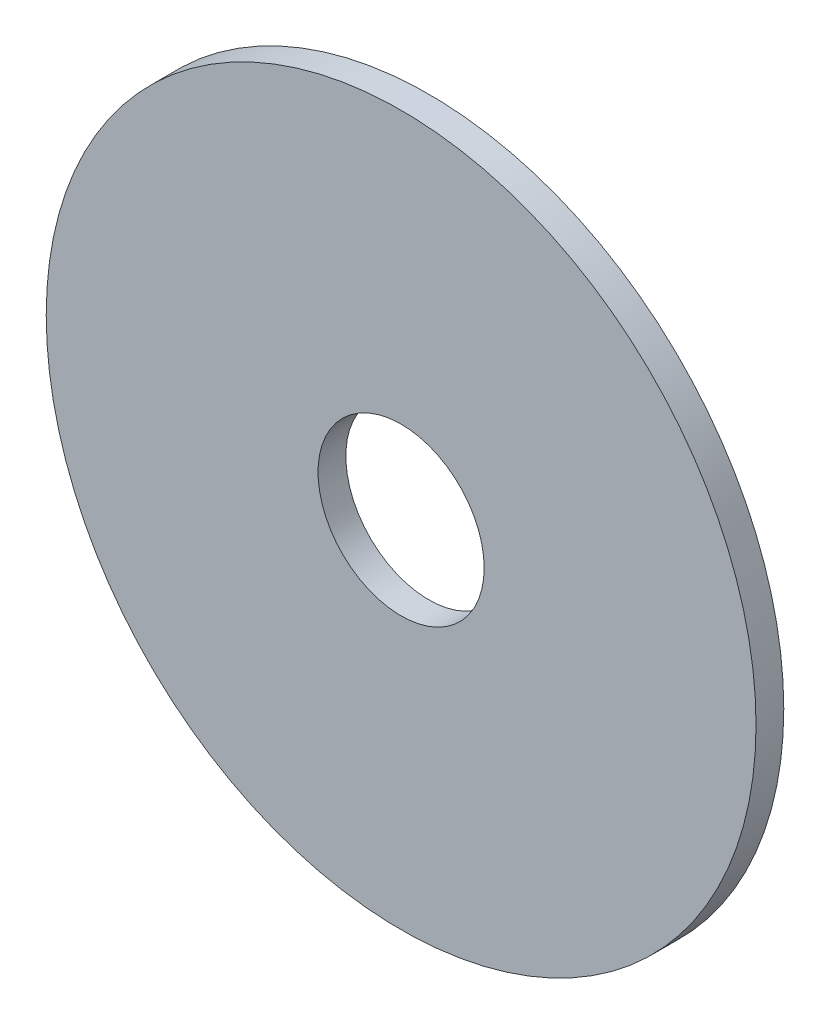
ISO-10303-21;
HEADER;
FILE_DESCRIPTION(('STEP AP214'),'2;1');
FILE_NAME('part.step','',(''),(''),'','','');
FILE_SCHEMA(('AUTOMOTIVE_DESIGN { 1 0 10303 214 1 1 1 1 }'));
ENDSEC;
DATA;
#1=APPLICATION_CONTEXT('core data for automotive mechanical design processes');
#2=APPLICATION_PROTOCOL_DEFINITION('international standard','automotive_design',2000,#1);
#3=PRODUCT_CONTEXT('',#1,'mechanical');
#4=PRODUCT('Part','Part','',(#3));
#5=PRODUCT_RELATED_PRODUCT_CATEGORY('part','',(#4));
#6=PRODUCT_DEFINITION_FORMATION('','',#4);
#7=PRODUCT_DEFINITION_CONTEXT('part definition',#1,'design');
#8=PRODUCT_DEFINITION('design','',#6,#7);
#9=PRODUCT_DEFINITION_SHAPE('','',#8);
#10=(LENGTH_UNIT() NAMED_UNIT(*) SI_UNIT(.MILLI.,.METRE.));
#11=(NAMED_UNIT(*) PLANE_ANGLE_UNIT() SI_UNIT($,.RADIAN.));
#12=(NAMED_UNIT(*) SI_UNIT($,.STERADIAN.) SOLID_ANGLE_UNIT());
#13=UNCERTAINTY_MEASURE_WITH_UNIT(LENGTH_MEASURE(1.E-05),#10,'distance_accuracy_value','');
#14=(GEOMETRIC_REPRESENTATION_CONTEXT(3) GLOBAL_UNCERTAINTY_ASSIGNED_CONTEXT((#13)) GLOBAL_UNIT_ASSIGNED_CONTEXT((#10,
#11,#12)) REPRESENTATION_CONTEXT('',''));
#15=CARTESIAN_POINT('',(0.,0.,0.));
#16=DIRECTION('',(0.,0.,1.));
#17=DIRECTION('',(1.,0.,0.));
#18=AXIS2_PLACEMENT_3D('',#15,#16,#17);
#19=CARTESIAN_POINT('',(0.,0.,6.));
#20=DIRECTION('',(0.,0.,-1.));
#21=DIRECTION('',(-1.,0.,0.));
#22=AXIS2_PLACEMENT_3D('',#19,#20,#21);
#23=CYLINDRICAL_SURFACE('',#22,76.73);
#24=CARTESIAN_POINT('',(0.,0.,6.));
#25=DIRECTION('',(0.,0.,1.));
#26=DIRECTION('',(1.,0.,0.));
#27=AXIS2_PLACEMENT_3D('',#24,#25,#26);
#28=CIRCLE('',#27,76.73);
#29=CARTESIAN_POINT('',(76.73,0.,6.));
#30=VERTEX_POINT('',#29);
#31=EDGE_CURVE('E10',#30,#30,#28,.T.);
#32=ORIENTED_EDGE('',*,*,#31,.F.);
#33=EDGE_LOOP('',(#32));
#34=FACE_BOUND('',#33,.T.);
#35=CARTESIAN_POINT('',(0.,0.,0.));
#36=DIRECTION('',(0.,0.,1.));
#37=DIRECTION('',(1.,0.,0.));
#38=AXIS2_PLACEMENT_3D('',#35,#36,#37);
#39=CIRCLE('',#38,76.73);
#40=CARTESIAN_POINT('',(76.73,0.,0.));
#41=VERTEX_POINT('',#40);
#42=EDGE_CURVE('E35',#41,#41,#39,.T.);
#43=ORIENTED_EDGE('',*,*,#42,.T.);
#44=EDGE_LOOP('',(#43));
#45=FACE_BOUND('',#44,.T.);
#46=ADVANCED_FACE('F32',(#34,#45),#23,.T.);
#47=CARTESIAN_POINT('',(0.,0.,6.));
#48=DIRECTION('',(0.,0.,1.));
#49=DIRECTION('',(1.,0.,0.));
#50=AXIS2_PLACEMENT_3D('',#47,#48,#49);
#51=PLANE('',#50);
#52=CARTESIAN_POINT('',(0.,0.,6.));
#53=DIRECTION('',(0.,0.,1.));
#54=DIRECTION('',(1.,0.,0.));
#55=AXIS2_PLACEMENT_3D('',#52,#53,#54);
#56=CIRCLE('',#55,17.9565);
#57=CARTESIAN_POINT('',(17.9565,0.,6.));
#58=VERTEX_POINT('',#57);
#59=EDGE_CURVE('E44',#58,#58,#56,.T.);
#60=ORIENTED_EDGE('',*,*,#59,.F.);
#61=EDGE_LOOP('',(#60));
#62=FACE_BOUND('',#61,.T.);
#63=ORIENTED_EDGE('',*,*,#31,.T.);
#64=EDGE_LOOP('',(#63));
#65=FACE_BOUND('',#64,.T.);
#66=ADVANCED_FACE('F59',(#62,#65),#51,.T.);
#67=CARTESIAN_POINT('',(0.,0.,0.));
#68=DIRECTION('',(0.,0.,1.));
#69=DIRECTION('',(1.,0.,0.));
#70=AXIS2_PLACEMENT_3D('',#67,#68,#69);
#71=PLANE('',#70);
#72=CARTESIAN_POINT('',(0.,0.,0.));
#73=DIRECTION('',(0.,0.,1.));
#74=DIRECTION('',(1.,0.,0.));
#75=AXIS2_PLACEMENT_3D('',#72,#73,#74);
#76=CIRCLE('',#75,17.9565);
#77=CARTESIAN_POINT('',(17.9565,0.,0.));
#78=VERTEX_POINT('',#77);
#79=EDGE_CURVE('E42',#78,#78,#76,.T.);
#80=ORIENTED_EDGE('',*,*,#79,.T.);
#81=EDGE_LOOP('',(#80));
#82=FACE_BOUND('',#81,.T.);
#83=ORIENTED_EDGE('',*,*,#42,.F.);
#84=EDGE_LOOP('',(#83));
#85=FACE_BOUND('',#84,.T.);
#86=ADVANCED_FACE('F50',(#82,#85),#71,.F.);
#87=CARTESIAN_POINT('',(0.,0.,0.));
#88=DIRECTION('',(0.,0.,1.));
#89=DIRECTION('',(1.,0.,0.));
#90=AXIS2_PLACEMENT_3D('',#87,#88,#89);
#91=CYLINDRICAL_SURFACE('',#90,17.9565);
#92=ORIENTED_EDGE('',*,*,#79,.F.);
#93=EDGE_LOOP('',(#92));
#94=FACE_BOUND('',#93,.T.);
#95=ORIENTED_EDGE('',*,*,#59,.T.);
#96=EDGE_LOOP('',(#95));
#97=FACE_BOUND('',#96,.T.);
#98=ADVANCED_FACE('F53',(#94,#97),#91,.F.);
#99=CLOSED_SHELL('',(#46,#66,#86,#98));
#100=MANIFOLD_SOLID_BREP('B2',#99);
#101=ADVANCED_BREP_SHAPE_REPRESENTATION('',(#18,#100),#14);
#102=SHAPE_DEFINITION_REPRESENTATION(#9,#101);
ENDSEC;
END-ISO-10303-21;
